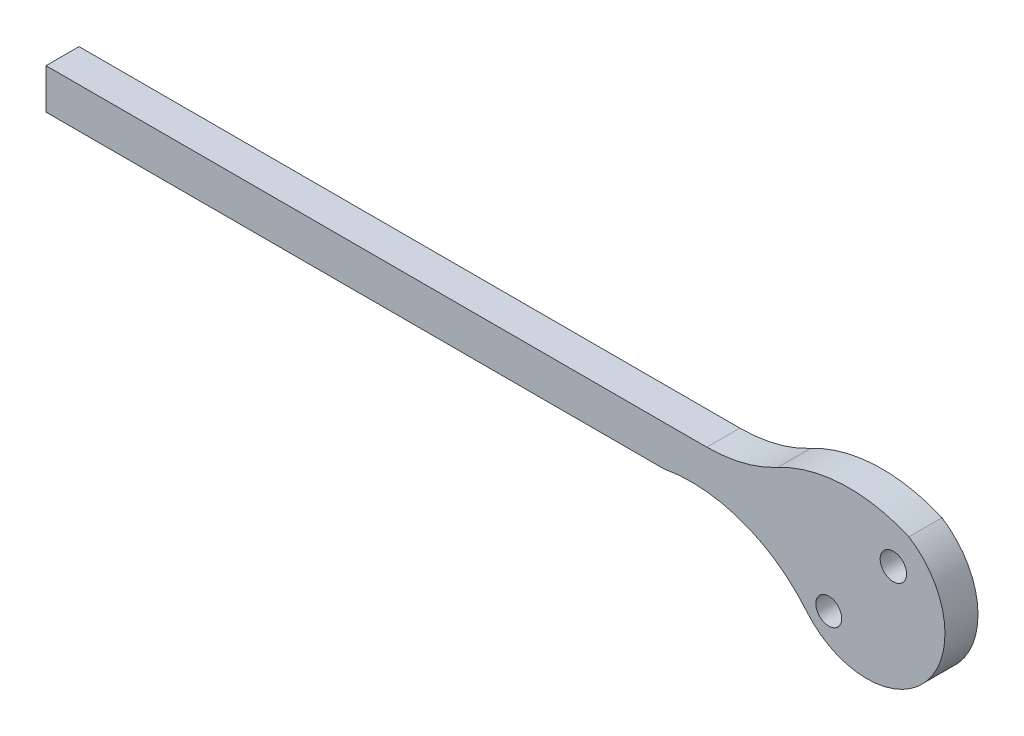
ISO-10303-21;
HEADER;
FILE_DESCRIPTION(('STEP AP214'),'2;1');
FILE_NAME('part.step','',(''),(''),'','','');
FILE_SCHEMA(('AUTOMOTIVE_DESIGN { 1 0 10303 214 1 1 1 1 }'));
ENDSEC;
DATA;
#1=APPLICATION_CONTEXT('core data for automotive mechanical design processes');
#2=APPLICATION_PROTOCOL_DEFINITION('international standard','automotive_design',2000,#1);
#3=PRODUCT_CONTEXT('',#1,'mechanical');
#4=PRODUCT('Part','Part','',(#3));
#5=PRODUCT_RELATED_PRODUCT_CATEGORY('part','',(#4));
#6=PRODUCT_DEFINITION_FORMATION('','',#4);
#7=PRODUCT_DEFINITION_CONTEXT('part definition',#1,'design');
#8=PRODUCT_DEFINITION('design','',#6,#7);
#9=PRODUCT_DEFINITION_SHAPE('','',#8);
#10=(LENGTH_UNIT() NAMED_UNIT(*) SI_UNIT(.MILLI.,.METRE.));
#11=(NAMED_UNIT(*) PLANE_ANGLE_UNIT() SI_UNIT($,.RADIAN.));
#12=(NAMED_UNIT(*) SI_UNIT($,.STERADIAN.) SOLID_ANGLE_UNIT());
#13=UNCERTAINTY_MEASURE_WITH_UNIT(LENGTH_MEASURE(1.E-05),#10,'distance_accuracy_value','');
#14=(GEOMETRIC_REPRESENTATION_CONTEXT(3) GLOBAL_UNCERTAINTY_ASSIGNED_CONTEXT((#13)) GLOBAL_UNIT_ASSIGNED_CONTEXT((#10,
#11,#12)) REPRESENTATION_CONTEXT('',''));
#15=CARTESIAN_POINT('',(0.,0.,0.));
#16=DIRECTION('',(0.,0.,1.));
#17=DIRECTION('',(1.,0.,0.));
#18=AXIS2_PLACEMENT_3D('',#15,#16,#17);
#19=CARTESIAN_POINT('',(43.8951161520855,-6.5251325411057,6.35));
#20=DIRECTION('',(0.,0.,-1.));
#21=DIRECTION('',(-1.,0.,0.));
#22=AXIS2_PLACEMENT_3D('',#19,#20,#21);
#23=PLANE('',#22);
#24=CARTESIAN_POINT('',(43.8951161520855,-6.5251325411057,6.35));
#25=DIRECTION('',(0.,0.,1.));
#26=DIRECTION('',(-1.,0.,0.));
#27=AXIS2_PLACEMENT_3D('',#24,#25,#26);
#28=CIRCLE('',#27,28.9806305307631);
#29=CARTESIAN_POINT('',(55.4007290612397,20.0736985900794,6.35));
#30=VERTEX_POINT('',#29);
#31=CARTESIAN_POINT('',(30.1576282500842,18.9926724605587,6.35));
#32=VERTEX_POINT('',#31);
#33=EDGE_CURVE('E143',#30,#32,#28,.T.);
#34=ORIENTED_EDGE('',*,*,#33,.T.);
#35=CARTESIAN_POINT('',(16.553800999297,44.262198704243,6.35));
#36=DIRECTION('',(0.,0.,-1.));
#37=DIRECTION('',(1.,0.,0.));
#38=AXIS2_PLACEMENT_3D('',#35,#36,#37);
#39=CIRCLE('',#38,28.6986597674789);
#40=CARTESIAN_POINT('',(16.553800999297,15.5635389367641,6.35));
#41=VERTEX_POINT('',#40);
#42=EDGE_CURVE('E96',#32,#41,#39,.T.);
#43=ORIENTED_EDGE('',*,*,#42,.T.);
#44=DIRECTION('',(-1.,0.,0.));
#45=VECTOR('',#44,1.);
#46=CARTESIAN_POINT('',(16.553800999297,15.5635389367641,6.35));
#47=LINE('',#46,#45);
#48=CARTESIAN_POINT('',(-110.446198999709,15.5635389367641,6.35));
#49=VERTEX_POINT('',#48);
#50=EDGE_CURVE('E155',#41,#49,#47,.T.);
#51=ORIENTED_EDGE('',*,*,#50,.T.);
#52=DIRECTION('',(0.,-1.,0.));
#53=VECTOR('',#52,1.);
#54=CARTESIAN_POINT('',(-110.446198999709,15.5635389367641,6.35));
#55=LINE('',#54,#53);
#56=CARTESIAN_POINT('',(-110.446198999709,7.82931349693466,6.35));
#57=VERTEX_POINT('',#56);
#58=EDGE_CURVE('E112',#49,#57,#55,.T.);
#59=ORIENTED_EDGE('',*,*,#58,.T.);
#60=DIRECTION('',(1.,0.,0.));
#61=VECTOR('',#60,1.);
#62=CARTESIAN_POINT('',(-110.446198999709,7.82931349693466,6.35));
#63=LINE('',#62,#61);
#64=CARTESIAN_POINT('',(8.32746961445988,7.82931349693465,6.35));
#65=VERTEX_POINT('',#64);
#66=EDGE_CURVE('E106',#57,#65,#63,.T.);
#67=ORIENTED_EDGE('',*,*,#66,.T.);
#68=CARTESIAN_POINT('',(13.5784407993938,-20.3566241290855,6.35));
#69=DIRECTION('',(0.,0.,-1.));
#70=DIRECTION('',(1.,0.,0.));
#71=AXIS2_PLACEMENT_3D('',#68,#69,#70);
#72=CIRCLE('',#71,28.6708872943078);
#73=CARTESIAN_POINT('',(35.7120643989107,-2.13239617293299,6.35));
#74=VERTEX_POINT('',#73);
#75=EDGE_CURVE('E110',#65,#74,#72,.T.);
#76=ORIENTED_EDGE('',*,*,#75,.T.);
#77=CARTESIAN_POINT('',(47.3093083237871,7.41646129271332,6.35));
#78=DIRECTION('',(0.,0.,1.));
#79=DIRECTION('',(-1.,0.,0.));
#80=AXIS2_PLACEMENT_3D('',#77,#78,#79);
#81=CIRCLE('',#80,15.0225412481482);
#82=EDGE_CURVE('E56',#74,#30,#81,.T.);
#83=ORIENTED_EDGE('',*,*,#82,.T.);
#84=EDGE_LOOP('',(#34,#43,#51,#59,#67,#76,#83));
#85=FACE_BOUND('',#84,.T.);
#86=CARTESIAN_POINT('',(52.4106777763149,13.6341206085301,6.35));
#87=DIRECTION('',(0.,0.,1.));
#88=DIRECTION('',(1.,0.,0.));
#89=AXIS2_PLACEMENT_3D('',#86,#87,#88);
#90=CIRCLE('',#89,2.53999999999988);
#91=CARTESIAN_POINT('',(54.9506777763148,13.6341206085301,6.35));
#92=VERTEX_POINT('',#91);
#93=EDGE_CURVE('E134',#92,#92,#90,.T.);
#94=ORIENTED_EDGE('',*,*,#93,.F.);
#95=EDGE_LOOP('',(#94));
#96=FACE_BOUND('',#95,.T.);
#97=CARTESIAN_POINT('',(40.0000000000001,1.89957771734584E-09,6.35));
#98=DIRECTION('',(0.,0.,1.));
#99=DIRECTION('',(1.,0.,0.));
#100=AXIS2_PLACEMENT_3D('',#97,#98,#99);
#101=CIRCLE('',#100,2.48919999999997);
#102=CARTESIAN_POINT('',(42.4892000000001,1.89957771734584E-09,6.35));
#103=VERTEX_POINT('',#102);
#104=EDGE_CURVE('E170',#103,#103,#101,.T.);
#105=ORIENTED_EDGE('',*,*,#104,.F.);
#106=EDGE_LOOP('',(#105));
#107=FACE_BOUND('',#106,.T.);
#108=ADVANCED_FACE('F39',(#85,#96,#107),#23,.F.);
#109=CARTESIAN_POINT('',(43.8951161520855,-6.5251325411057,0.));
#110=DIRECTION('',(0.,0.,-1.));
#111=DIRECTION('',(-1.,0.,0.));
#112=AXIS2_PLACEMENT_3D('',#109,#110,#111);
#113=PLANE('',#112);
#114=CARTESIAN_POINT('',(52.4106777763149,13.6341206085301,0.));
#115=DIRECTION('',(0.,0.,1.));
#116=DIRECTION('',(1.,0.,0.));
#117=AXIS2_PLACEMENT_3D('',#114,#115,#116);
#118=CIRCLE('',#117,2.53999999999988);
#119=CARTESIAN_POINT('',(54.9506777763148,13.6341206085301,0.));
#120=VERTEX_POINT('',#119);
#121=EDGE_CURVE('E167',#120,#120,#118,.T.);
#122=ORIENTED_EDGE('',*,*,#121,.T.);
#123=EDGE_LOOP('',(#122));
#124=FACE_BOUND('',#123,.T.);
#125=CARTESIAN_POINT('',(43.8951161520855,-6.5251325411057,0.));
#126=DIRECTION('',(0.,0.,1.));
#127=DIRECTION('',(-1.,0.,0.));
#128=AXIS2_PLACEMENT_3D('',#125,#126,#127);
#129=CIRCLE('',#128,28.9806305307631);
#130=CARTESIAN_POINT('',(55.4007290612397,20.0736985900794,0.));
#131=VERTEX_POINT('',#130);
#132=CARTESIAN_POINT('',(30.1576282500842,18.9926724605587,0.));
#133=VERTEX_POINT('',#132);
#134=EDGE_CURVE('E130',#131,#133,#129,.T.);
#135=ORIENTED_EDGE('',*,*,#134,.F.);
#136=CARTESIAN_POINT('',(47.3093083237871,7.41646129271332,0.));
#137=DIRECTION('',(0.,0.,1.));
#138=DIRECTION('',(-1.,0.,0.));
#139=AXIS2_PLACEMENT_3D('',#136,#137,#138);
#140=CIRCLE('',#139,15.0225412481482);
#141=CARTESIAN_POINT('',(35.7120643989107,-2.13239617293299,0.));
#142=VERTEX_POINT('',#141);
#143=EDGE_CURVE('E88',#142,#131,#140,.T.);
#144=ORIENTED_EDGE('',*,*,#143,.F.);
#145=CARTESIAN_POINT('',(13.5784407993938,-20.3566241290855,0.));
#146=DIRECTION('',(0.,0.,-1.));
#147=DIRECTION('',(1.,0.,0.));
#148=AXIS2_PLACEMENT_3D('',#145,#146,#147);
#149=CIRCLE('',#148,28.6708872943078);
#150=CARTESIAN_POINT('',(8.32746961445988,7.82931349693465,0.));
#151=VERTEX_POINT('',#150);
#152=EDGE_CURVE('E82',#151,#142,#149,.T.);
#153=ORIENTED_EDGE('',*,*,#152,.F.);
#154=DIRECTION('',(1.,0.,0.));
#155=VECTOR('',#154,1.);
#156=CARTESIAN_POINT('',(-110.446198999709,7.82931349693466,0.));
#157=LINE('',#156,#155);
#158=CARTESIAN_POINT('',(-110.446198999709,7.82931349693466,0.));
#159=VERTEX_POINT('',#158);
#160=EDGE_CURVE('E120',#159,#151,#157,.T.);
#161=ORIENTED_EDGE('',*,*,#160,.F.);
#162=DIRECTION('',(0.,-1.,0.));
#163=VECTOR('',#162,1.);
#164=CARTESIAN_POINT('',(-110.446198999709,15.5635389367641,0.));
#165=LINE('',#164,#163);
#166=CARTESIAN_POINT('',(-110.446198999709,15.5635389367641,0.));
#167=VERTEX_POINT('',#166);
#168=EDGE_CURVE('E138',#167,#159,#165,.T.);
#169=ORIENTED_EDGE('',*,*,#168,.F.);
#170=DIRECTION('',(-1.,0.,0.));
#171=VECTOR('',#170,1.);
#172=CARTESIAN_POINT('',(16.553800999297,15.5635389367641,0.));
#173=LINE('',#172,#171);
#174=CARTESIAN_POINT('',(16.553800999297,15.5635389367641,0.));
#175=VERTEX_POINT('',#174);
#176=EDGE_CURVE('E136',#175,#167,#173,.T.);
#177=ORIENTED_EDGE('',*,*,#176,.F.);
#178=CARTESIAN_POINT('',(16.553800999297,44.262198704243,0.));
#179=DIRECTION('',(0.,0.,-1.));
#180=DIRECTION('',(1.,0.,0.));
#181=AXIS2_PLACEMENT_3D('',#178,#179,#180);
#182=CIRCLE('',#181,28.6986597674789);
#183=EDGE_CURVE('E133',#133,#175,#182,.T.);
#184=ORIENTED_EDGE('',*,*,#183,.F.);
#185=EDGE_LOOP('',(#135,#144,#153,#161,#169,#177,#184));
#186=FACE_BOUND('',#185,.T.);
#187=CARTESIAN_POINT('',(40.0000000000001,1.89957771734584E-09,0.));
#188=DIRECTION('',(0.,0.,1.));
#189=DIRECTION('',(1.,0.,0.));
#190=AXIS2_PLACEMENT_3D('',#187,#188,#189);
#191=CIRCLE('',#190,2.48919999999997);
#192=CARTESIAN_POINT('',(42.4892000000001,1.89957771734584E-09,0.));
#193=VERTEX_POINT('',#192);
#194=EDGE_CURVE('E173',#193,#193,#191,.T.);
#195=ORIENTED_EDGE('',*,*,#194,.T.);
#196=EDGE_LOOP('',(#195));
#197=FACE_BOUND('',#196,.T.);
#198=ADVANCED_FACE('F159',(#124,#186,#197),#113,.T.);
#199=CARTESIAN_POINT('',(43.8951161520855,-6.5251325411057,6.35));
#200=DIRECTION('',(0.,0.,-1.));
#201=DIRECTION('',(-1.,0.,0.));
#202=AXIS2_PLACEMENT_3D('',#199,#200,#201);
#203=CYLINDRICAL_SURFACE('',#202,28.9806305307631);
#204=ORIENTED_EDGE('',*,*,#134,.T.);
#205=DIRECTION('',(0.,0.,-1.));
#206=VECTOR('',#205,1.);
#207=CARTESIAN_POINT('',(30.1576282500842,18.9926724605587,6.35));
#208=LINE('',#207,#206);
#209=EDGE_CURVE('E11',#32,#133,#208,.T.);
#210=ORIENTED_EDGE('',*,*,#209,.F.);
#211=ORIENTED_EDGE('',*,*,#33,.F.);
#212=DIRECTION('',(0.,0.,-1.));
#213=VECTOR('',#212,1.);
#214=CARTESIAN_POINT('',(55.4007290612397,20.0736985900794,6.35));
#215=LINE('',#214,#213);
#216=EDGE_CURVE('E126',#30,#131,#215,.T.);
#217=ORIENTED_EDGE('',*,*,#216,.T.);
#218=EDGE_LOOP('',(#204,#210,#211,#217));
#219=FACE_BOUND('',#218,.T.);
#220=ADVANCED_FACE('F41',(#219),#203,.T.);
#221=CARTESIAN_POINT('',(16.553800999297,44.262198704243,6.35));
#222=DIRECTION('',(0.,0.,-1.));
#223=DIRECTION('',(-1.,0.,0.));
#224=AXIS2_PLACEMENT_3D('',#221,#222,#223);
#225=CYLINDRICAL_SURFACE('',#224,28.6986597674789);
#226=ORIENTED_EDGE('',*,*,#183,.T.);
#227=DIRECTION('',(0.,0.,-1.));
#228=VECTOR('',#227,1.);
#229=CARTESIAN_POINT('',(16.553800999297,15.5635389367641,6.35));
#230=LINE('',#229,#228);
#231=EDGE_CURVE('E48',#41,#175,#230,.T.);
#232=ORIENTED_EDGE('',*,*,#231,.F.);
#233=ORIENTED_EDGE('',*,*,#42,.F.);
#234=ORIENTED_EDGE('',*,*,#209,.T.);
#235=EDGE_LOOP('',(#226,#232,#233,#234));
#236=FACE_BOUND('',#235,.T.);
#237=ADVANCED_FACE('F203',(#236),#225,.F.);
#238=CARTESIAN_POINT('',(16.553800999297,15.5635389367641,6.35));
#239=DIRECTION('',(0.,-1.,0.));
#240=DIRECTION('',(0.,0.,-1.));
#241=AXIS2_PLACEMENT_3D('',#238,#239,#240);
#242=PLANE('',#241);
#243=ORIENTED_EDGE('',*,*,#176,.T.);
#244=DIRECTION('',(0.,0.,-1.));
#245=VECTOR('',#244,1.);
#246=CARTESIAN_POINT('',(-110.446198999709,15.5635389367641,6.35));
#247=LINE('',#246,#245);
#248=EDGE_CURVE('E147',#49,#167,#247,.T.);
#249=ORIENTED_EDGE('',*,*,#248,.F.);
#250=ORIENTED_EDGE('',*,*,#50,.F.);
#251=ORIENTED_EDGE('',*,*,#231,.T.);
#252=EDGE_LOOP('',(#243,#249,#250,#251));
#253=FACE_BOUND('',#252,.T.);
#254=ADVANCED_FACE('F153',(#253),#242,.F.);
#255=CARTESIAN_POINT('',(-110.446198999709,15.5635389367641,6.35));
#256=DIRECTION('',(1.,0.,0.));
#257=DIRECTION('',(0.,0.,-1.));
#258=AXIS2_PLACEMENT_3D('',#255,#256,#257);
#259=PLANE('',#258);
#260=ORIENTED_EDGE('',*,*,#168,.T.);
#261=DIRECTION('',(0.,0.,-1.));
#262=VECTOR('',#261,1.);
#263=CARTESIAN_POINT('',(-110.446198999709,7.82931349693466,6.35));
#264=LINE('',#263,#262);
#265=EDGE_CURVE('E121',#57,#159,#264,.T.);
#266=ORIENTED_EDGE('',*,*,#265,.F.);
#267=ORIENTED_EDGE('',*,*,#58,.F.);
#268=ORIENTED_EDGE('',*,*,#248,.T.);
#269=EDGE_LOOP('',(#260,#266,#267,#268));
#270=FACE_BOUND('',#269,.T.);
#271=ADVANCED_FACE('F162',(#270),#259,.F.);
#272=CARTESIAN_POINT('',(-110.446198999709,7.82931349693466,6.35));
#273=DIRECTION('',(0.,1.,0.));
#274=DIRECTION('',(0.,0.,1.));
#275=AXIS2_PLACEMENT_3D('',#272,#273,#274);
#276=PLANE('',#275);
#277=ORIENTED_EDGE('',*,*,#160,.T.);
#278=DIRECTION('',(0.,0.,-1.));
#279=VECTOR('',#278,1.);
#280=CARTESIAN_POINT('',(8.32746961445988,7.82931349693465,6.35));
#281=LINE('',#280,#279);
#282=EDGE_CURVE('E117',#65,#151,#281,.T.);
#283=ORIENTED_EDGE('',*,*,#282,.F.);
#284=ORIENTED_EDGE('',*,*,#66,.F.);
#285=ORIENTED_EDGE('',*,*,#265,.T.);
#286=EDGE_LOOP('',(#277,#283,#284,#285));
#287=FACE_BOUND('',#286,.T.);
#288=ADVANCED_FACE('F118',(#287),#276,.F.);
#289=CARTESIAN_POINT('',(13.5784407993938,-20.3566241290855,6.35));
#290=DIRECTION('',(0.,0.,-1.));
#291=DIRECTION('',(-1.,0.,0.));
#292=AXIS2_PLACEMENT_3D('',#289,#290,#291);
#293=CYLINDRICAL_SURFACE('',#292,28.6708872943078);
#294=ORIENTED_EDGE('',*,*,#152,.T.);
#295=DIRECTION('',(0.,0.,-1.));
#296=VECTOR('',#295,1.);
#297=CARTESIAN_POINT('',(35.7120643989107,-2.13239617293299,6.35));
#298=LINE('',#297,#296);
#299=EDGE_CURVE('E122',#74,#142,#298,.T.);
#300=ORIENTED_EDGE('',*,*,#299,.F.);
#301=ORIENTED_EDGE('',*,*,#75,.F.);
#302=ORIENTED_EDGE('',*,*,#282,.T.);
#303=EDGE_LOOP('',(#294,#300,#301,#302));
#304=FACE_BOUND('',#303,.T.);
#305=ADVANCED_FACE('F124',(#304),#293,.F.);
#306=CARTESIAN_POINT('',(47.3093083237871,7.41646129271332,6.35));
#307=DIRECTION('',(0.,0.,-1.));
#308=DIRECTION('',(-1.,0.,0.));
#309=AXIS2_PLACEMENT_3D('',#306,#307,#308);
#310=CYLINDRICAL_SURFACE('',#309,15.0225412481482);
#311=ORIENTED_EDGE('',*,*,#143,.T.);
#312=ORIENTED_EDGE('',*,*,#216,.F.);
#313=ORIENTED_EDGE('',*,*,#82,.F.);
#314=ORIENTED_EDGE('',*,*,#299,.T.);
#315=EDGE_LOOP('',(#311,#312,#313,#314));
#316=FACE_BOUND('',#315,.T.);
#317=ADVANCED_FACE('F193',(#316),#310,.T.);
#318=CARTESIAN_POINT('',(52.4106777763149,13.6341206085301,6.35));
#319=DIRECTION('',(0.,0.,-1.));
#320=DIRECTION('',(-1.,0.,0.));
#321=AXIS2_PLACEMENT_3D('',#318,#319,#320);
#322=CYLINDRICAL_SURFACE('',#321,2.53999999999988);
#323=ORIENTED_EDGE('',*,*,#93,.T.);
#324=EDGE_LOOP('',(#323));
#325=FACE_BOUND('',#324,.T.);
#326=ORIENTED_EDGE('',*,*,#121,.F.);
#327=EDGE_LOOP('',(#326));
#328=FACE_BOUND('',#327,.T.);
#329=ADVANCED_FACE('F190',(#325,#328),#322,.F.);
#330=CARTESIAN_POINT('',(40.0000000000001,1.89957771734584E-09,6.35));
#331=DIRECTION('',(0.,0.,-1.));
#332=DIRECTION('',(-1.,0.,0.));
#333=AXIS2_PLACEMENT_3D('',#330,#331,#332);
#334=CYLINDRICAL_SURFACE('',#333,2.48919999999997);
#335=ORIENTED_EDGE('',*,*,#104,.T.);
#336=EDGE_LOOP('',(#335));
#337=FACE_BOUND('',#336,.T.);
#338=ORIENTED_EDGE('',*,*,#194,.F.);
#339=EDGE_LOOP('',(#338));
#340=FACE_BOUND('',#339,.T.);
#341=ADVANCED_FACE('F179',(#337,#340),#334,.F.);
#342=CLOSED_SHELL('',(#108,#198,#220,#237,#254,#271,#288,#305,#317,#329,#341));
#343=MANIFOLD_SOLID_BREP('B2',#342);
#344=ADVANCED_BREP_SHAPE_REPRESENTATION('',(#18,#343),#14);
#345=SHAPE_DEFINITION_REPRESENTATION(#9,#344);
ENDSEC;
END-ISO-10303-21;
